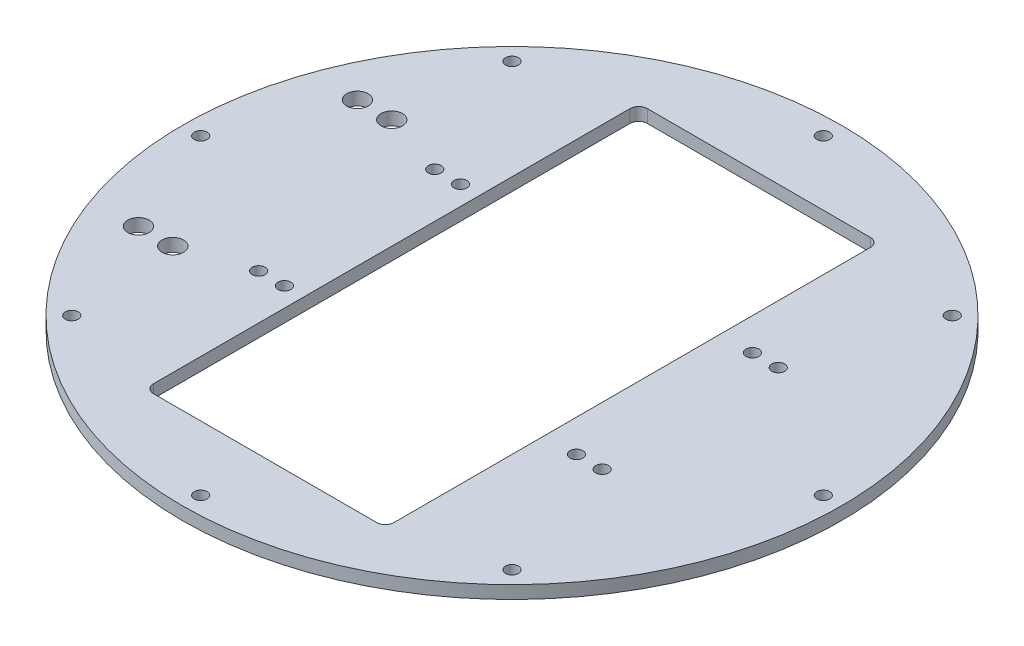
ISO-10303-21;
HEADER;
FILE_DESCRIPTION(('STEP AP214'),'2;1');
FILE_NAME('part.step','',(''),(''),'','','');
FILE_SCHEMA(('AUTOMOTIVE_DESIGN { 1 0 10303 214 1 1 1 1 }'));
ENDSEC;
DATA;
#1=APPLICATION_CONTEXT('core data for automotive mechanical design processes');
#2=APPLICATION_PROTOCOL_DEFINITION('international standard','automotive_design',2000,#1);
#3=PRODUCT_CONTEXT('',#1,'mechanical');
#4=PRODUCT('Part','Part','',(#3));
#5=PRODUCT_RELATED_PRODUCT_CATEGORY('part','',(#4));
#6=PRODUCT_DEFINITION_FORMATION('','',#4);
#7=PRODUCT_DEFINITION_CONTEXT('part definition',#1,'design');
#8=PRODUCT_DEFINITION('design','',#6,#7);
#9=PRODUCT_DEFINITION_SHAPE('','',#8);
#10=(LENGTH_UNIT() NAMED_UNIT(*) SI_UNIT(.MILLI.,.METRE.));
#11=(NAMED_UNIT(*) PLANE_ANGLE_UNIT() SI_UNIT($,.RADIAN.));
#12=(NAMED_UNIT(*) SI_UNIT($,.STERADIAN.) SOLID_ANGLE_UNIT());
#13=UNCERTAINTY_MEASURE_WITH_UNIT(LENGTH_MEASURE(1.E-05),#10,'distance_accuracy_value','');
#14=(GEOMETRIC_REPRESENTATION_CONTEXT(3) GLOBAL_UNCERTAINTY_ASSIGNED_CONTEXT((#13)) GLOBAL_UNIT_ASSIGNED_CONTEXT((#10,
#11,#12)) REPRESENTATION_CONTEXT('',''));
#15=CARTESIAN_POINT('',(0.,0.,0.));
#16=DIRECTION('',(0.,0.,1.));
#17=DIRECTION('',(1.,0.,0.));
#18=AXIS2_PLACEMENT_3D('',#15,#16,#17);
#19=CARTESIAN_POINT('',(0.,3.,0.));
#20=DIRECTION('',(0.,1.,0.));
#21=DIRECTION('',(0.,0.,1.));
#22=AXIS2_PLACEMENT_3D('',#19,#20,#21);
#23=PLANE('',#22);
#24=CARTESIAN_POINT('',(-53.5,3.,25.5));
#25=DIRECTION('',(0.,1.,0.));
#26=DIRECTION('',(0.,0.,-1.));
#27=AXIS2_PLACEMENT_3D('',#24,#25,#26);
#28=CIRCLE('',#27,2.5);
#29=CARTESIAN_POINT('',(-53.5,3.,23.));
#30=VERTEX_POINT('',#29);
#31=EDGE_CURVE('E288',#30,#30,#28,.T.);
#32=ORIENTED_EDGE('',*,*,#31,.F.);
#33=EDGE_LOOP('',(#32));
#34=FACE_BOUND('',#33,.T.);
#35=CARTESIAN_POINT('',(-53.5,3.,-25.5));
#36=DIRECTION('',(0.,1.,0.));
#37=DIRECTION('',(0.,0.,1.));
#38=AXIS2_PLACEMENT_3D('',#35,#36,#37);
#39=CIRCLE('',#38,2.5);
#40=CARTESIAN_POINT('',(-53.5,3.,-23.));
#41=VERTEX_POINT('',#40);
#42=EDGE_CURVE('E276',#41,#41,#39,.T.);
#43=ORIENTED_EDGE('',*,*,#42,.F.);
#44=EDGE_LOOP('',(#43));
#45=FACE_BOUND('',#44,.T.);
#46=CARTESIAN_POINT('',(35.5,3.,20.4999999999999));
#47=DIRECTION('',(0.,1.,0.));
#48=DIRECTION('',(0.,0.,1.));
#49=AXIS2_PLACEMENT_3D('',#46,#47,#48);
#50=CIRCLE('',#49,1.5);
#51=CARTESIAN_POINT('',(35.5,3.,21.9999999999999));
#52=VERTEX_POINT('',#51);
#53=EDGE_CURVE('E264',#52,#52,#50,.T.);
#54=ORIENTED_EDGE('',*,*,#53,.F.);
#55=EDGE_LOOP('',(#54));
#56=FACE_BOUND('',#55,.T.);
#57=CARTESIAN_POINT('',(35.5,3.,-20.5000000000001));
#58=DIRECTION('',(0.,1.,0.));
#59=DIRECTION('',(0.,0.,1.));
#60=AXIS2_PLACEMENT_3D('',#57,#58,#59);
#61=CIRCLE('',#60,1.5);
#62=CARTESIAN_POINT('',(35.5,3.,-19.0000000000001));
#63=VERTEX_POINT('',#62);
#64=EDGE_CURVE('E252',#63,#63,#61,.T.);
#65=ORIENTED_EDGE('',*,*,#64,.F.);
#66=EDGE_LOOP('',(#65));
#67=FACE_BOUND('',#66,.T.);
#68=CARTESIAN_POINT('',(-38.5,3.,-20.5000000000001));
#69=DIRECTION('',(0.,1.,0.));
#70=DIRECTION('',(0.,0.,1.));
#71=AXIS2_PLACEMENT_3D('',#68,#69,#70);
#72=CIRCLE('',#71,1.5);
#73=CARTESIAN_POINT('',(-38.5,3.,-19.0000000000001));
#74=VERTEX_POINT('',#73);
#75=EDGE_CURVE('E240',#74,#74,#72,.T.);
#76=ORIENTED_EDGE('',*,*,#75,.F.);
#77=EDGE_LOOP('',(#76));
#78=FACE_BOUND('',#77,.T.);
#79=CARTESIAN_POINT('',(-32.5,3.,20.4999999999999));
#80=DIRECTION('',(0.,1.,0.));
#81=DIRECTION('',(0.,0.,1.));
#82=AXIS2_PLACEMENT_3D('',#79,#80,#81);
#83=CIRCLE('',#82,1.5);
#84=CARTESIAN_POINT('',(-32.5,3.,21.9999999999999));
#85=VERTEX_POINT('',#84);
#86=EDGE_CURVE('E228',#85,#85,#83,.T.);
#87=ORIENTED_EDGE('',*,*,#86,.F.);
#88=EDGE_LOOP('',(#87));
#89=FACE_BOUND('',#88,.T.);
#90=CARTESIAN_POINT('',(-72.5,3.,0.));
#91=DIRECTION('',(0.,1.,0.));
#92=DIRECTION('',(0.,0.,1.));
#93=AXIS2_PLACEMENT_3D('',#90,#91,#92);
#94=CIRCLE('',#93,1.5);
#95=CARTESIAN_POINT('',(-72.5,3.,1.50000000000001));
#96=VERTEX_POINT('',#95);
#97=EDGE_CURVE('E216',#96,#96,#94,.T.);
#98=ORIENTED_EDGE('',*,*,#97,.F.);
#99=EDGE_LOOP('',(#98));
#100=FACE_BOUND('',#99,.T.);
#101=CARTESIAN_POINT('',(0.,3.,72.5));
#102=DIRECTION('',(0.,1.,0.));
#103=DIRECTION('',(0.,0.,1.));
#104=AXIS2_PLACEMENT_3D('',#101,#102,#103);
#105=CIRCLE('',#104,1.5);
#106=CARTESIAN_POINT('',(0.,3.,74.));
#107=VERTEX_POINT('',#106);
#108=EDGE_CURVE('E204',#107,#107,#105,.T.);
#109=ORIENTED_EDGE('',*,*,#108,.F.);
#110=EDGE_LOOP('',(#109));
#111=FACE_BOUND('',#110,.T.);
#112=CARTESIAN_POINT('',(72.5,3.,0.));
#113=DIRECTION('',(0.,1.,0.));
#114=DIRECTION('',(0.,0.,1.));
#115=AXIS2_PLACEMENT_3D('',#112,#113,#114);
#116=CIRCLE('',#115,1.5);
#117=CARTESIAN_POINT('',(72.5,3.,1.49999999999999));
#118=VERTEX_POINT('',#117);
#119=EDGE_CURVE('E192',#118,#118,#116,.T.);
#120=ORIENTED_EDGE('',*,*,#119,.F.);
#121=EDGE_LOOP('',(#120));
#122=FACE_BOUND('',#121,.T.);
#123=DIRECTION('',(-1.,0.,0.));
#124=VECTOR('',#123,1.);
#125=CARTESIAN_POINT('',(-27.9999999999894,3.,-57.5));
#126=LINE('',#125,#124);
#127=CARTESIAN_POINT('',(25.9999999999894,3.,-57.5));
#128=VERTEX_POINT('',#127);
#129=CARTESIAN_POINT('',(-25.9999999999894,3.,-57.5));
#130=VERTEX_POINT('',#129);
#131=EDGE_CURVE('E155',#128,#130,#126,.T.);
#132=ORIENTED_EDGE('',*,*,#131,.F.);
#133=CARTESIAN_POINT('',(25.9999999999894,3.,-55.5));
#134=DIRECTION('',(0.,1.,0.));
#135=DIRECTION('',(0.,0.,1.));
#136=AXIS2_PLACEMENT_3D('',#133,#134,#135);
#137=CIRCLE('',#136,2.);
#138=CARTESIAN_POINT('',(27.9999999999894,3.,-55.5));
#139=VERTEX_POINT('',#138);
#140=EDGE_CURVE('E108',#128,#139,#137,.F.);
#141=ORIENTED_EDGE('',*,*,#140,.T.);
#142=DIRECTION('',(0.,0.,-1.));
#143=VECTOR('',#142,1.);
#144=CARTESIAN_POINT('',(27.9999999999894,3.,-57.5));
#145=LINE('',#144,#143);
#146=CARTESIAN_POINT('',(27.9999999999894,3.,55.5));
#147=VERTEX_POINT('',#146);
#148=EDGE_CURVE('E153',#147,#139,#145,.T.);
#149=ORIENTED_EDGE('',*,*,#148,.F.);
#150=CARTESIAN_POINT('',(25.9999999999894,3.,55.5));
#151=DIRECTION('',(0.,1.,0.));
#152=DIRECTION('',(0.,0.,1.));
#153=AXIS2_PLACEMENT_3D('',#150,#151,#152);
#154=CIRCLE('',#153,2.);
#155=CARTESIAN_POINT('',(25.9999999999894,3.,57.5));
#156=VERTEX_POINT('',#155);
#157=EDGE_CURVE('E145',#147,#156,#154,.F.);
#158=ORIENTED_EDGE('',*,*,#157,.T.);
#159=DIRECTION('',(1.,0.,0.));
#160=VECTOR('',#159,1.);
#161=CARTESIAN_POINT('',(-27.9999999999894,3.,57.5));
#162=LINE('',#161,#160);
#163=CARTESIAN_POINT('',(-25.9999999999894,3.,57.5));
#164=VERTEX_POINT('',#163);
#165=EDGE_CURVE('E178',#164,#156,#162,.T.);
#166=ORIENTED_EDGE('',*,*,#165,.F.);
#167=CARTESIAN_POINT('',(-25.9999999999894,3.,55.5));
#168=DIRECTION('',(0.,1.,0.));
#169=DIRECTION('',(0.,0.,1.));
#170=AXIS2_PLACEMENT_3D('',#167,#168,#169);
#171=CIRCLE('',#170,2.);
#172=CARTESIAN_POINT('',(-27.9999999999894,3.,55.5));
#173=VERTEX_POINT('',#172);
#174=EDGE_CURVE('E141',#164,#173,#171,.F.);
#175=ORIENTED_EDGE('',*,*,#174,.T.);
#176=DIRECTION('',(0.,0.,1.));
#177=VECTOR('',#176,1.);
#178=CARTESIAN_POINT('',(-27.9999999999894,3.,-57.5));
#179=LINE('',#178,#177);
#180=CARTESIAN_POINT('',(-27.9999999999894,3.,-55.5));
#181=VERTEX_POINT('',#180);
#182=EDGE_CURVE('E182',#181,#173,#179,.T.);
#183=ORIENTED_EDGE('',*,*,#182,.F.);
#184=CARTESIAN_POINT('',(-25.9999999999894,3.,-55.5));
#185=DIRECTION('',(0.,1.,0.));
#186=DIRECTION('',(0.,0.,1.));
#187=AXIS2_PLACEMENT_3D('',#184,#185,#186);
#188=CIRCLE('',#187,2.);
#189=EDGE_CURVE('E11',#181,#130,#188,.F.);
#190=ORIENTED_EDGE('',*,*,#189,.T.);
#191=EDGE_LOOP('',(#132,#141,#149,#158,#166,#175,#183,#190));
#192=FACE_BOUND('',#191,.T.);
#193=CARTESIAN_POINT('',(0.,3.,-72.5));
#194=DIRECTION('',(0.,1.,0.));
#195=DIRECTION('',(0.,0.,1.));
#196=AXIS2_PLACEMENT_3D('',#193,#194,#195);
#197=CIRCLE('',#196,1.5);
#198=CARTESIAN_POINT('',(0.,3.,-71.));
#199=VERTEX_POINT('',#198);
#200=EDGE_CURVE('E173',#199,#199,#197,.T.);
#201=ORIENTED_EDGE('',*,*,#200,.F.);
#202=EDGE_LOOP('',(#201));
#203=FACE_BOUND('',#202,.T.);
#204=CARTESIAN_POINT('',(0.,3.,0.));
#205=DIRECTION('',(0.,1.,0.));
#206=DIRECTION('',(0.,0.,1.));
#207=AXIS2_PLACEMENT_3D('',#204,#205,#206);
#208=CIRCLE('',#207,76.75);
#209=CARTESIAN_POINT('',(0.,3.,76.75));
#210=VERTEX_POINT('',#209);
#211=EDGE_CURVE('E118',#210,#210,#208,.T.);
#212=ORIENTED_EDGE('',*,*,#211,.T.);
#213=EDGE_LOOP('',(#212));
#214=FACE_BOUND('',#213,.T.);
#215=CARTESIAN_POINT('',(51.2652416360247,3.,-51.2652416360247));
#216=DIRECTION('',(0.,1.,0.));
#217=DIRECTION('',(0.,0.,1.));
#218=AXIS2_PLACEMENT_3D('',#215,#216,#217);
#219=CIRCLE('',#218,1.50000000000001);
#220=CARTESIAN_POINT('',(51.2652416360247,3.,-49.7652416360247));
#221=VERTEX_POINT('',#220);
#222=EDGE_CURVE('E168',#221,#221,#219,.T.);
#223=ORIENTED_EDGE('',*,*,#222,.F.);
#224=EDGE_LOOP('',(#223));
#225=FACE_BOUND('',#224,.T.);
#226=CARTESIAN_POINT('',(51.2652416360247,3.,51.2652416360247));
#227=DIRECTION('',(0.,1.,0.));
#228=DIRECTION('',(0.,0.,1.));
#229=AXIS2_PLACEMENT_3D('',#226,#227,#228);
#230=CIRCLE('',#229,1.50000000000001);
#231=CARTESIAN_POINT('',(51.2652416360247,3.,52.7652416360247));
#232=VERTEX_POINT('',#231);
#233=EDGE_CURVE('E198',#232,#232,#230,.T.);
#234=ORIENTED_EDGE('',*,*,#233,.F.);
#235=EDGE_LOOP('',(#234));
#236=FACE_BOUND('',#235,.T.);
#237=CARTESIAN_POINT('',(-51.2652416360247,3.,51.2652416360247));
#238=DIRECTION('',(0.,1.,0.));
#239=DIRECTION('',(0.,0.,1.));
#240=AXIS2_PLACEMENT_3D('',#237,#238,#239);
#241=CIRCLE('',#240,1.5);
#242=CARTESIAN_POINT('',(-51.2652416360247,3.,52.7652416360247));
#243=VERTEX_POINT('',#242);
#244=EDGE_CURVE('E210',#243,#243,#241,.T.);
#245=ORIENTED_EDGE('',*,*,#244,.F.);
#246=EDGE_LOOP('',(#245));
#247=FACE_BOUND('',#246,.T.);
#248=CARTESIAN_POINT('',(-51.2652416360247,3.,-51.2652416360247));
#249=DIRECTION('',(0.,1.,0.));
#250=DIRECTION('',(0.,0.,1.));
#251=AXIS2_PLACEMENT_3D('',#248,#249,#250);
#252=CIRCLE('',#251,1.50000000000001);
#253=CARTESIAN_POINT('',(-51.2652416360247,3.,-49.7652416360247));
#254=VERTEX_POINT('',#253);
#255=EDGE_CURVE('E222',#254,#254,#252,.T.);
#256=ORIENTED_EDGE('',*,*,#255,.F.);
#257=EDGE_LOOP('',(#256));
#258=FACE_BOUND('',#257,.T.);
#259=CARTESIAN_POINT('',(-38.5,3.,20.4999999999999));
#260=DIRECTION('',(0.,1.,0.));
#261=DIRECTION('',(0.,0.,1.));
#262=AXIS2_PLACEMENT_3D('',#259,#260,#261);
#263=CIRCLE('',#262,1.5);
#264=CARTESIAN_POINT('',(-38.5,3.,21.9999999999999));
#265=VERTEX_POINT('',#264);
#266=EDGE_CURVE('E234',#265,#265,#263,.T.);
#267=ORIENTED_EDGE('',*,*,#266,.F.);
#268=EDGE_LOOP('',(#267));
#269=FACE_BOUND('',#268,.T.);
#270=CARTESIAN_POINT('',(-32.5,3.,-20.5000000000001));
#271=DIRECTION('',(0.,1.,0.));
#272=DIRECTION('',(0.,0.,1.));
#273=AXIS2_PLACEMENT_3D('',#270,#271,#272);
#274=CIRCLE('',#273,1.5);
#275=CARTESIAN_POINT('',(-32.5,3.,-19.0000000000001));
#276=VERTEX_POINT('',#275);
#277=EDGE_CURVE('E246',#276,#276,#274,.T.);
#278=ORIENTED_EDGE('',*,*,#277,.F.);
#279=EDGE_LOOP('',(#278));
#280=FACE_BOUND('',#279,.T.);
#281=CARTESIAN_POINT('',(41.5,3.,-20.5000000000001));
#282=DIRECTION('',(0.,1.,0.));
#283=DIRECTION('',(0.,0.,1.));
#284=AXIS2_PLACEMENT_3D('',#281,#282,#283);
#285=CIRCLE('',#284,1.5);
#286=CARTESIAN_POINT('',(41.5,3.,-19.0000000000001));
#287=VERTEX_POINT('',#286);
#288=EDGE_CURVE('E258',#287,#287,#285,.T.);
#289=ORIENTED_EDGE('',*,*,#288,.F.);
#290=EDGE_LOOP('',(#289));
#291=FACE_BOUND('',#290,.T.);
#292=CARTESIAN_POINT('',(41.5,3.,20.4999999999999));
#293=DIRECTION('',(0.,1.,0.));
#294=DIRECTION('',(0.,0.,1.));
#295=AXIS2_PLACEMENT_3D('',#292,#293,#294);
#296=CIRCLE('',#295,1.5);
#297=CARTESIAN_POINT('',(41.5,3.,21.9999999999999));
#298=VERTEX_POINT('',#297);
#299=EDGE_CURVE('E270',#298,#298,#296,.T.);
#300=ORIENTED_EDGE('',*,*,#299,.F.);
#301=EDGE_LOOP('',(#300));
#302=FACE_BOUND('',#301,.T.);
#303=CARTESIAN_POINT('',(-61.5,3.,-25.5));
#304=DIRECTION('',(0.,1.,0.));
#305=DIRECTION('',(0.,0.,1.));
#306=AXIS2_PLACEMENT_3D('',#303,#304,#305);
#307=CIRCLE('',#306,2.5);
#308=CARTESIAN_POINT('',(-61.5,3.,-23.));
#309=VERTEX_POINT('',#308);
#310=EDGE_CURVE('E282',#309,#309,#307,.T.);
#311=ORIENTED_EDGE('',*,*,#310,.F.);
#312=EDGE_LOOP('',(#311));
#313=FACE_BOUND('',#312,.T.);
#314=CARTESIAN_POINT('',(-61.5,3.,25.5));
#315=DIRECTION('',(0.,1.,0.));
#316=DIRECTION('',(0.,0.,-1.));
#317=AXIS2_PLACEMENT_3D('',#314,#315,#316);
#318=CIRCLE('',#317,2.5);
#319=CARTESIAN_POINT('',(-61.5,3.,23.));
#320=VERTEX_POINT('',#319);
#321=EDGE_CURVE('E294',#320,#320,#318,.T.);
#322=ORIENTED_EDGE('',*,*,#321,.F.);
#323=EDGE_LOOP('',(#322));
#324=FACE_BOUND('',#323,.T.);
#325=ADVANCED_FACE('F33',(#34,#45,#56,#67,#78,#89,#100,#111,#122,#192,#203,#214,#225,#236,#247,
#258,#269,#280,#291,#302,#313,#324),#23,.T.);
#326=CARTESIAN_POINT('',(0.,0.,0.));
#327=DIRECTION('',(0.,1.,0.));
#328=DIRECTION('',(0.,0.,1.));
#329=AXIS2_PLACEMENT_3D('',#326,#327,#328);
#330=PLANE('',#329);
#331=CARTESIAN_POINT('',(0.,0.,-72.5));
#332=DIRECTION('',(0.,1.,0.));
#333=DIRECTION('',(0.,0.,1.));
#334=AXIS2_PLACEMENT_3D('',#331,#332,#333);
#335=CIRCLE('',#334,1.5);
#336=CARTESIAN_POINT('',(0.,0.,-71.));
#337=VERTEX_POINT('',#336);
#338=EDGE_CURVE('E176',#337,#337,#335,.T.);
#339=ORIENTED_EDGE('',*,*,#338,.T.);
#340=EDGE_LOOP('',(#339));
#341=FACE_BOUND('',#340,.T.);
#342=CARTESIAN_POINT('',(0.,0.,0.));
#343=DIRECTION('',(0.,1.,0.));
#344=DIRECTION('',(0.,0.,1.));
#345=AXIS2_PLACEMENT_3D('',#342,#343,#344);
#346=CIRCLE('',#345,76.75);
#347=CARTESIAN_POINT('',(0.,0.,76.75));
#348=VERTEX_POINT('',#347);
#349=EDGE_CURVE('E123',#348,#348,#346,.T.);
#350=ORIENTED_EDGE('',*,*,#349,.F.);
#351=EDGE_LOOP('',(#350));
#352=FACE_BOUND('',#351,.T.);
#353=DIRECTION('',(1.,0.,0.));
#354=VECTOR('',#353,1.);
#355=CARTESIAN_POINT('',(-27.9999999999894,0.,57.5));
#356=LINE('',#355,#354);
#357=CARTESIAN_POINT('',(-25.9999999999894,0.,57.5));
#358=VERTEX_POINT('',#357);
#359=CARTESIAN_POINT('',(25.9999999999894,0.,57.5));
#360=VERTEX_POINT('',#359);
#361=EDGE_CURVE('E116',#358,#360,#356,.T.);
#362=ORIENTED_EDGE('',*,*,#361,.T.);
#363=CARTESIAN_POINT('',(25.9999999999894,0.,55.5));
#364=DIRECTION('',(0.,1.,0.));
#365=DIRECTION('',(0.,0.,1.));
#366=AXIS2_PLACEMENT_3D('',#363,#364,#365);
#367=CIRCLE('',#366,2.);
#368=CARTESIAN_POINT('',(27.9999999999894,0.,55.5));
#369=VERTEX_POINT('',#368);
#370=EDGE_CURVE('E143',#360,#369,#367,.T.);
#371=ORIENTED_EDGE('',*,*,#370,.T.);
#372=DIRECTION('',(0.,0.,-1.));
#373=VECTOR('',#372,1.);
#374=CARTESIAN_POINT('',(27.9999999999894,0.,-57.5));
#375=LINE('',#374,#373);
#376=CARTESIAN_POINT('',(27.9999999999894,0.,-55.5));
#377=VERTEX_POINT('',#376);
#378=EDGE_CURVE('E165',#369,#377,#375,.T.);
#379=ORIENTED_EDGE('',*,*,#378,.T.);
#380=CARTESIAN_POINT('',(25.9999999999894,0.,-55.5));
#381=DIRECTION('',(0.,1.,0.));
#382=DIRECTION('',(0.,0.,1.));
#383=AXIS2_PLACEMENT_3D('',#380,#381,#382);
#384=CIRCLE('',#383,2.);
#385=CARTESIAN_POINT('',(25.9999999999894,0.,-57.5));
#386=VERTEX_POINT('',#385);
#387=EDGE_CURVE('E147',#377,#386,#384,.T.);
#388=ORIENTED_EDGE('',*,*,#387,.T.);
#389=DIRECTION('',(-1.,0.,0.));
#390=VECTOR('',#389,1.);
#391=CARTESIAN_POINT('',(-27.9999999999894,0.,-57.5));
#392=LINE('',#391,#390);
#393=CARTESIAN_POINT('',(-25.9999999999894,0.,-57.5));
#394=VERTEX_POINT('',#393);
#395=EDGE_CURVE('E103',#386,#394,#392,.T.);
#396=ORIENTED_EDGE('',*,*,#395,.T.);
#397=CARTESIAN_POINT('',(-25.9999999999894,0.,-55.5));
#398=DIRECTION('',(0.,1.,0.));
#399=DIRECTION('',(0.,0.,1.));
#400=AXIS2_PLACEMENT_3D('',#397,#398,#399);
#401=CIRCLE('',#400,2.);
#402=CARTESIAN_POINT('',(-27.9999999999894,0.,-55.5));
#403=VERTEX_POINT('',#402);
#404=EDGE_CURVE('E41',#394,#403,#401,.T.);
#405=ORIENTED_EDGE('',*,*,#404,.T.);
#406=DIRECTION('',(0.,0.,1.));
#407=VECTOR('',#406,1.);
#408=CARTESIAN_POINT('',(-27.9999999999894,0.,-57.5));
#409=LINE('',#408,#407);
#410=CARTESIAN_POINT('',(-27.9999999999894,0.,55.5));
#411=VERTEX_POINT('',#410);
#412=EDGE_CURVE('E102',#403,#411,#409,.T.);
#413=ORIENTED_EDGE('',*,*,#412,.T.);
#414=CARTESIAN_POINT('',(-25.9999999999894,0.,55.5));
#415=DIRECTION('',(0.,1.,0.));
#416=DIRECTION('',(0.,0.,1.));
#417=AXIS2_PLACEMENT_3D('',#414,#415,#416);
#418=CIRCLE('',#417,2.);
#419=EDGE_CURVE('E139',#411,#358,#418,.T.);
#420=ORIENTED_EDGE('',*,*,#419,.T.);
#421=EDGE_LOOP('',(#362,#371,#379,#388,#396,#405,#413,#420));
#422=FACE_BOUND('',#421,.T.);
#423=CARTESIAN_POINT('',(51.2652416360247,0.,-51.2652416360247));
#424=DIRECTION('',(0.,1.,0.));
#425=DIRECTION('',(0.,0.,1.));
#426=AXIS2_PLACEMENT_3D('',#423,#424,#425);
#427=CIRCLE('',#426,1.50000000000001);
#428=CARTESIAN_POINT('',(51.2652416360247,0.,-49.7652416360247));
#429=VERTEX_POINT('',#428);
#430=EDGE_CURVE('E189',#429,#429,#427,.T.);
#431=ORIENTED_EDGE('',*,*,#430,.T.);
#432=EDGE_LOOP('',(#431));
#433=FACE_BOUND('',#432,.T.);
#434=CARTESIAN_POINT('',(72.5,0.,0.));
#435=DIRECTION('',(0.,1.,0.));
#436=DIRECTION('',(0.,0.,1.));
#437=AXIS2_PLACEMENT_3D('',#434,#435,#436);
#438=CIRCLE('',#437,1.5);
#439=CARTESIAN_POINT('',(72.5,0.,1.49999999999999));
#440=VERTEX_POINT('',#439);
#441=EDGE_CURVE('E195',#440,#440,#438,.T.);
#442=ORIENTED_EDGE('',*,*,#441,.T.);
#443=EDGE_LOOP('',(#442));
#444=FACE_BOUND('',#443,.T.);
#445=CARTESIAN_POINT('',(51.2652416360247,0.,51.2652416360247));
#446=DIRECTION('',(0.,1.,0.));
#447=DIRECTION('',(0.,0.,1.));
#448=AXIS2_PLACEMENT_3D('',#445,#446,#447);
#449=CIRCLE('',#448,1.50000000000001);
#450=CARTESIAN_POINT('',(51.2652416360247,0.,52.7652416360247));
#451=VERTEX_POINT('',#450);
#452=EDGE_CURVE('E201',#451,#451,#449,.T.);
#453=ORIENTED_EDGE('',*,*,#452,.T.);
#454=EDGE_LOOP('',(#453));
#455=FACE_BOUND('',#454,.T.);
#456=CARTESIAN_POINT('',(0.,0.,72.5));
#457=DIRECTION('',(0.,1.,0.));
#458=DIRECTION('',(0.,0.,1.));
#459=AXIS2_PLACEMENT_3D('',#456,#457,#458);
#460=CIRCLE('',#459,1.5);
#461=CARTESIAN_POINT('',(0.,0.,74.));
#462=VERTEX_POINT('',#461);
#463=EDGE_CURVE('E207',#462,#462,#460,.T.);
#464=ORIENTED_EDGE('',*,*,#463,.T.);
#465=EDGE_LOOP('',(#464));
#466=FACE_BOUND('',#465,.T.);
#467=CARTESIAN_POINT('',(-51.2652416360247,0.,51.2652416360247));
#468=DIRECTION('',(0.,1.,0.));
#469=DIRECTION('',(0.,0.,1.));
#470=AXIS2_PLACEMENT_3D('',#467,#468,#469);
#471=CIRCLE('',#470,1.5);
#472=CARTESIAN_POINT('',(-51.2652416360247,0.,52.7652416360247));
#473=VERTEX_POINT('',#472);
#474=EDGE_CURVE('E213',#473,#473,#471,.T.);
#475=ORIENTED_EDGE('',*,*,#474,.T.);
#476=EDGE_LOOP('',(#475));
#477=FACE_BOUND('',#476,.T.);
#478=CARTESIAN_POINT('',(-72.5,0.,0.));
#479=DIRECTION('',(0.,1.,0.));
#480=DIRECTION('',(0.,0.,1.));
#481=AXIS2_PLACEMENT_3D('',#478,#479,#480);
#482=CIRCLE('',#481,1.5);
#483=CARTESIAN_POINT('',(-72.5,0.,1.50000000000001));
#484=VERTEX_POINT('',#483);
#485=EDGE_CURVE('E219',#484,#484,#482,.T.);
#486=ORIENTED_EDGE('',*,*,#485,.T.);
#487=EDGE_LOOP('',(#486));
#488=FACE_BOUND('',#487,.T.);
#489=CARTESIAN_POINT('',(-51.2652416360247,0.,-51.2652416360247));
#490=DIRECTION('',(0.,1.,0.));
#491=DIRECTION('',(0.,0.,1.));
#492=AXIS2_PLACEMENT_3D('',#489,#490,#491);
#493=CIRCLE('',#492,1.50000000000001);
#494=CARTESIAN_POINT('',(-51.2652416360247,0.,-49.7652416360247));
#495=VERTEX_POINT('',#494);
#496=EDGE_CURVE('E225',#495,#495,#493,.T.);
#497=ORIENTED_EDGE('',*,*,#496,.T.);
#498=EDGE_LOOP('',(#497));
#499=FACE_BOUND('',#498,.T.);
#500=CARTESIAN_POINT('',(-32.5,0.,20.4999999999999));
#501=DIRECTION('',(0.,1.,0.));
#502=DIRECTION('',(0.,0.,1.));
#503=AXIS2_PLACEMENT_3D('',#500,#501,#502);
#504=CIRCLE('',#503,1.5);
#505=CARTESIAN_POINT('',(-32.5,0.,21.9999999999999));
#506=VERTEX_POINT('',#505);
#507=EDGE_CURVE('E231',#506,#506,#504,.T.);
#508=ORIENTED_EDGE('',*,*,#507,.T.);
#509=EDGE_LOOP('',(#508));
#510=FACE_BOUND('',#509,.T.);
#511=CARTESIAN_POINT('',(-38.5,0.,20.4999999999999));
#512=DIRECTION('',(0.,1.,0.));
#513=DIRECTION('',(0.,0.,1.));
#514=AXIS2_PLACEMENT_3D('',#511,#512,#513);
#515=CIRCLE('',#514,1.5);
#516=CARTESIAN_POINT('',(-38.5,0.,21.9999999999999));
#517=VERTEX_POINT('',#516);
#518=EDGE_CURVE('E237',#517,#517,#515,.T.);
#519=ORIENTED_EDGE('',*,*,#518,.T.);
#520=EDGE_LOOP('',(#519));
#521=FACE_BOUND('',#520,.T.);
#522=CARTESIAN_POINT('',(-38.5,0.,-20.5000000000001));
#523=DIRECTION('',(0.,1.,0.));
#524=DIRECTION('',(0.,0.,1.));
#525=AXIS2_PLACEMENT_3D('',#522,#523,#524);
#526=CIRCLE('',#525,1.5);
#527=CARTESIAN_POINT('',(-38.5,0.,-19.0000000000001));
#528=VERTEX_POINT('',#527);
#529=EDGE_CURVE('E243',#528,#528,#526,.T.);
#530=ORIENTED_EDGE('',*,*,#529,.T.);
#531=EDGE_LOOP('',(#530));
#532=FACE_BOUND('',#531,.T.);
#533=CARTESIAN_POINT('',(-32.5,0.,-20.5000000000001));
#534=DIRECTION('',(0.,1.,0.));
#535=DIRECTION('',(0.,0.,1.));
#536=AXIS2_PLACEMENT_3D('',#533,#534,#535);
#537=CIRCLE('',#536,1.5);
#538=CARTESIAN_POINT('',(-32.5,0.,-19.0000000000001));
#539=VERTEX_POINT('',#538);
#540=EDGE_CURVE('E249',#539,#539,#537,.T.);
#541=ORIENTED_EDGE('',*,*,#540,.T.);
#542=EDGE_LOOP('',(#541));
#543=FACE_BOUND('',#542,.T.);
#544=CARTESIAN_POINT('',(35.5,0.,-20.5000000000001));
#545=DIRECTION('',(0.,1.,0.));
#546=DIRECTION('',(0.,0.,1.));
#547=AXIS2_PLACEMENT_3D('',#544,#545,#546);
#548=CIRCLE('',#547,1.5);
#549=CARTESIAN_POINT('',(35.5,0.,-19.0000000000001));
#550=VERTEX_POINT('',#549);
#551=EDGE_CURVE('E255',#550,#550,#548,.T.);
#552=ORIENTED_EDGE('',*,*,#551,.T.);
#553=EDGE_LOOP('',(#552));
#554=FACE_BOUND('',#553,.T.);
#555=CARTESIAN_POINT('',(41.5,0.,-20.5000000000001));
#556=DIRECTION('',(0.,1.,0.));
#557=DIRECTION('',(0.,0.,1.));
#558=AXIS2_PLACEMENT_3D('',#555,#556,#557);
#559=CIRCLE('',#558,1.5);
#560=CARTESIAN_POINT('',(41.5,0.,-19.0000000000001));
#561=VERTEX_POINT('',#560);
#562=EDGE_CURVE('E261',#561,#561,#559,.T.);
#563=ORIENTED_EDGE('',*,*,#562,.T.);
#564=EDGE_LOOP('',(#563));
#565=FACE_BOUND('',#564,.T.);
#566=CARTESIAN_POINT('',(35.5,0.,20.4999999999999));
#567=DIRECTION('',(0.,1.,0.));
#568=DIRECTION('',(0.,0.,1.));
#569=AXIS2_PLACEMENT_3D('',#566,#567,#568);
#570=CIRCLE('',#569,1.5);
#571=CARTESIAN_POINT('',(35.5,0.,21.9999999999999));
#572=VERTEX_POINT('',#571);
#573=EDGE_CURVE('E267',#572,#572,#570,.T.);
#574=ORIENTED_EDGE('',*,*,#573,.T.);
#575=EDGE_LOOP('',(#574));
#576=FACE_BOUND('',#575,.T.);
#577=CARTESIAN_POINT('',(41.5,0.,20.4999999999999));
#578=DIRECTION('',(0.,1.,0.));
#579=DIRECTION('',(0.,0.,1.));
#580=AXIS2_PLACEMENT_3D('',#577,#578,#579);
#581=CIRCLE('',#580,1.5);
#582=CARTESIAN_POINT('',(41.5,0.,21.9999999999999));
#583=VERTEX_POINT('',#582);
#584=EDGE_CURVE('E273',#583,#583,#581,.T.);
#585=ORIENTED_EDGE('',*,*,#584,.T.);
#586=EDGE_LOOP('',(#585));
#587=FACE_BOUND('',#586,.T.);
#588=CARTESIAN_POINT('',(-53.5,0.,-25.5));
#589=DIRECTION('',(0.,1.,0.));
#590=DIRECTION('',(0.,0.,1.));
#591=AXIS2_PLACEMENT_3D('',#588,#589,#590);
#592=CIRCLE('',#591,2.5);
#593=CARTESIAN_POINT('',(-53.5,0.,-23.));
#594=VERTEX_POINT('',#593);
#595=EDGE_CURVE('E279',#594,#594,#592,.T.);
#596=ORIENTED_EDGE('',*,*,#595,.T.);
#597=EDGE_LOOP('',(#596));
#598=FACE_BOUND('',#597,.T.);
#599=CARTESIAN_POINT('',(-61.5,0.,-25.5));
#600=DIRECTION('',(0.,1.,0.));
#601=DIRECTION('',(0.,0.,1.));
#602=AXIS2_PLACEMENT_3D('',#599,#600,#601);
#603=CIRCLE('',#602,2.5);
#604=CARTESIAN_POINT('',(-61.5,0.,-23.));
#605=VERTEX_POINT('',#604);
#606=EDGE_CURVE('E285',#605,#605,#603,.T.);
#607=ORIENTED_EDGE('',*,*,#606,.T.);
#608=EDGE_LOOP('',(#607));
#609=FACE_BOUND('',#608,.T.);
#610=CARTESIAN_POINT('',(-53.5,0.,25.5));
#611=DIRECTION('',(0.,1.,0.));
#612=DIRECTION('',(0.,0.,-1.));
#613=AXIS2_PLACEMENT_3D('',#610,#611,#612);
#614=CIRCLE('',#613,2.5);
#615=CARTESIAN_POINT('',(-53.5,0.,23.));
#616=VERTEX_POINT('',#615);
#617=EDGE_CURVE('E291',#616,#616,#614,.T.);
#618=ORIENTED_EDGE('',*,*,#617,.T.);
#619=EDGE_LOOP('',(#618));
#620=FACE_BOUND('',#619,.T.);
#621=CARTESIAN_POINT('',(-61.5,0.,25.5));
#622=DIRECTION('',(0.,1.,0.));
#623=DIRECTION('',(0.,0.,-1.));
#624=AXIS2_PLACEMENT_3D('',#621,#622,#623);
#625=CIRCLE('',#624,2.5);
#626=CARTESIAN_POINT('',(-61.5,0.,23.));
#627=VERTEX_POINT('',#626);
#628=EDGE_CURVE('E297',#627,#627,#625,.T.);
#629=ORIENTED_EDGE('',*,*,#628,.T.);
#630=EDGE_LOOP('',(#629));
#631=FACE_BOUND('',#630,.T.);
#632=ADVANCED_FACE('F100',(#341,#352,#422,#433,#444,#455,#466,#477,#488,#499,#510,#521,#532,
#543,#554,#565,#576,#587,#598,#609,#620,#631),#330,.F.);
#633=CARTESIAN_POINT('',(0.,3.,0.));
#634=DIRECTION('',(0.,-1.,0.));
#635=DIRECTION('',(0.,0.,-1.));
#636=AXIS2_PLACEMENT_3D('',#633,#634,#635);
#637=CYLINDRICAL_SURFACE('',#636,76.75);
#638=ORIENTED_EDGE('',*,*,#211,.F.);
#639=EDGE_LOOP('',(#638));
#640=FACE_BOUND('',#639,.T.);
#641=ORIENTED_EDGE('',*,*,#349,.T.);
#642=EDGE_LOOP('',(#641));
#643=FACE_BOUND('',#642,.T.);
#644=ADVANCED_FACE('F312',(#640,#643),#637,.T.);
#645=CARTESIAN_POINT('',(0.,3.,-72.5));
#646=DIRECTION('',(0.,-1.,0.));
#647=DIRECTION('',(0.,0.,-1.));
#648=AXIS2_PLACEMENT_3D('',#645,#646,#647);
#649=CYLINDRICAL_SURFACE('',#648,1.5);
#650=ORIENTED_EDGE('',*,*,#200,.T.);
#651=EDGE_LOOP('',(#650));
#652=FACE_BOUND('',#651,.T.);
#653=ORIENTED_EDGE('',*,*,#338,.F.);
#654=EDGE_LOOP('',(#653));
#655=FACE_BOUND('',#654,.T.);
#656=ADVANCED_FACE('F317',(#652,#655),#649,.F.);
#657=CARTESIAN_POINT('',(27.9999999999894,3.,-57.5));
#658=DIRECTION('',(-1.,0.,0.));
#659=DIRECTION('',(0.,0.,1.));
#660=AXIS2_PLACEMENT_3D('',#657,#658,#659);
#661=PLANE('',#660);
#662=ORIENTED_EDGE('',*,*,#378,.F.);
#663=DIRECTION('',(0.,-1.,0.));
#664=VECTOR('',#663,1.);
#665=CARTESIAN_POINT('',(27.9999999999894,3.,55.5));
#666=LINE('',#665,#664);
#667=EDGE_CURVE('E134',#369,#147,#666,.F.);
#668=ORIENTED_EDGE('',*,*,#667,.T.);
#669=ORIENTED_EDGE('',*,*,#148,.T.);
#670=DIRECTION('',(0.,-1.,0.));
#671=VECTOR('',#670,1.);
#672=CARTESIAN_POINT('',(27.9999999999894,0.,-55.5));
#673=LINE('',#672,#671);
#674=EDGE_CURVE('E131',#139,#377,#673,.T.);
#675=ORIENTED_EDGE('',*,*,#674,.T.);
#676=EDGE_LOOP('',(#662,#668,#669,#675));
#677=FACE_BOUND('',#676,.T.);
#678=ADVANCED_FACE('F160',(#677),#661,.T.);
#679=CARTESIAN_POINT('',(-27.9999999999894,3.,-57.5));
#680=DIRECTION('',(0.,0.,1.));
#681=DIRECTION('',(1.,0.,0.));
#682=AXIS2_PLACEMENT_3D('',#679,#680,#681);
#683=PLANE('',#682);
#684=ORIENTED_EDGE('',*,*,#395,.F.);
#685=DIRECTION('',(0.,-1.,0.));
#686=VECTOR('',#685,1.);
#687=CARTESIAN_POINT('',(25.9999999999894,3.,-57.5));
#688=LINE('',#687,#686);
#689=EDGE_CURVE('E53',#386,#128,#688,.F.);
#690=ORIENTED_EDGE('',*,*,#689,.T.);
#691=ORIENTED_EDGE('',*,*,#131,.T.);
#692=DIRECTION('',(0.,-1.,0.));
#693=VECTOR('',#692,1.);
#694=CARTESIAN_POINT('',(-25.9999999999894,0.,-57.5));
#695=LINE('',#694,#693);
#696=EDGE_CURVE('E136',#130,#394,#695,.T.);
#697=ORIENTED_EDGE('',*,*,#696,.T.);
#698=EDGE_LOOP('',(#684,#690,#691,#697));
#699=FACE_BOUND('',#698,.T.);
#700=ADVANCED_FACE('F166',(#699),#683,.T.);
#701=CARTESIAN_POINT('',(-27.9999999999894,3.,-57.5));
#702=DIRECTION('',(1.,0.,0.));
#703=DIRECTION('',(0.,0.,-1.));
#704=AXIS2_PLACEMENT_3D('',#701,#702,#703);
#705=PLANE('',#704);
#706=ORIENTED_EDGE('',*,*,#182,.T.);
#707=DIRECTION('',(0.,-1.,0.));
#708=VECTOR('',#707,1.);
#709=CARTESIAN_POINT('',(-27.9999999999894,0.,55.5));
#710=LINE('',#709,#708);
#711=EDGE_CURVE('E115',#173,#411,#710,.T.);
#712=ORIENTED_EDGE('',*,*,#711,.T.);
#713=ORIENTED_EDGE('',*,*,#412,.F.);
#714=DIRECTION('',(0.,-1.,0.));
#715=VECTOR('',#714,1.);
#716=CARTESIAN_POINT('',(-27.9999999999894,3.,-55.5));
#717=LINE('',#716,#715);
#718=EDGE_CURVE('E113',#403,#181,#717,.F.);
#719=ORIENTED_EDGE('',*,*,#718,.T.);
#720=EDGE_LOOP('',(#706,#712,#713,#719));
#721=FACE_BOUND('',#720,.T.);
#722=ADVANCED_FACE('F112',(#721),#705,.T.);
#723=CARTESIAN_POINT('',(-27.9999999999894,3.,57.5));
#724=DIRECTION('',(0.,0.,-1.));
#725=DIRECTION('',(-1.,0.,0.));
#726=AXIS2_PLACEMENT_3D('',#723,#724,#725);
#727=PLANE('',#726);
#728=ORIENTED_EDGE('',*,*,#361,.F.);
#729=DIRECTION('',(0.,-1.,0.));
#730=VECTOR('',#729,1.);
#731=CARTESIAN_POINT('',(-25.9999999999894,3.,57.5));
#732=LINE('',#731,#730);
#733=EDGE_CURVE('E129',#358,#164,#732,.F.);
#734=ORIENTED_EDGE('',*,*,#733,.T.);
#735=ORIENTED_EDGE('',*,*,#165,.T.);
#736=DIRECTION('',(0.,-1.,0.));
#737=VECTOR('',#736,1.);
#738=CARTESIAN_POINT('',(25.9999999999894,0.,57.5));
#739=LINE('',#738,#737);
#740=EDGE_CURVE('E120',#156,#360,#739,.T.);
#741=ORIENTED_EDGE('',*,*,#740,.T.);
#742=EDGE_LOOP('',(#728,#734,#735,#741));
#743=FACE_BOUND('',#742,.T.);
#744=ADVANCED_FACE('F359',(#743),#727,.T.);
#745=CARTESIAN_POINT('',(51.2652416360247,3.,-51.2652416360247));
#746=DIRECTION('',(0.,-1.,0.));
#747=DIRECTION('',(0.,0.,-1.));
#748=AXIS2_PLACEMENT_3D('',#745,#746,#747);
#749=CYLINDRICAL_SURFACE('',#748,1.50000000000001);
#750=ORIENTED_EDGE('',*,*,#222,.T.);
#751=EDGE_LOOP('',(#750));
#752=FACE_BOUND('',#751,.T.);
#753=ORIENTED_EDGE('',*,*,#430,.F.);
#754=EDGE_LOOP('',(#753));
#755=FACE_BOUND('',#754,.T.);
#756=ADVANCED_FACE('F364',(#752,#755),#749,.F.);
#757=CARTESIAN_POINT('',(72.5,3.,0.));
#758=DIRECTION('',(0.,-1.,0.));
#759=DIRECTION('',(0.,0.,-1.));
#760=AXIS2_PLACEMENT_3D('',#757,#758,#759);
#761=CYLINDRICAL_SURFACE('',#760,1.5);
#762=ORIENTED_EDGE('',*,*,#119,.T.);
#763=EDGE_LOOP('',(#762));
#764=FACE_BOUND('',#763,.T.);
#765=ORIENTED_EDGE('',*,*,#441,.F.);
#766=EDGE_LOOP('',(#765));
#767=FACE_BOUND('',#766,.T.);
#768=ADVANCED_FACE('F568',(#764,#767),#761,.F.);
#769=CARTESIAN_POINT('',(51.2652416360247,3.,51.2652416360247));
#770=DIRECTION('',(0.,-1.,0.));
#771=DIRECTION('',(0.,0.,-1.));
#772=AXIS2_PLACEMENT_3D('',#769,#770,#771);
#773=CYLINDRICAL_SURFACE('',#772,1.50000000000001);
#774=ORIENTED_EDGE('',*,*,#233,.T.);
#775=EDGE_LOOP('',(#774));
#776=FACE_BOUND('',#775,.T.);
#777=ORIENTED_EDGE('',*,*,#452,.F.);
#778=EDGE_LOOP('',(#777));
#779=FACE_BOUND('',#778,.T.);
#780=ADVANCED_FACE('F558',(#776,#779),#773,.F.);
#781=CARTESIAN_POINT('',(0.,3.,72.5));
#782=DIRECTION('',(0.,-1.,0.));
#783=DIRECTION('',(0.,0.,-1.));
#784=AXIS2_PLACEMENT_3D('',#781,#782,#783);
#785=CYLINDRICAL_SURFACE('',#784,1.5);
#786=ORIENTED_EDGE('',*,*,#108,.T.);
#787=EDGE_LOOP('',(#786));
#788=FACE_BOUND('',#787,.T.);
#789=ORIENTED_EDGE('',*,*,#463,.F.);
#790=EDGE_LOOP('',(#789));
#791=FACE_BOUND('',#790,.T.);
#792=ADVANCED_FACE('F548',(#788,#791),#785,.F.);
#793=CARTESIAN_POINT('',(-51.2652416360247,3.,51.2652416360247));
#794=DIRECTION('',(0.,-1.,0.));
#795=DIRECTION('',(0.,0.,-1.));
#796=AXIS2_PLACEMENT_3D('',#793,#794,#795);
#797=CYLINDRICAL_SURFACE('',#796,1.5);
#798=ORIENTED_EDGE('',*,*,#244,.T.);
#799=EDGE_LOOP('',(#798));
#800=FACE_BOUND('',#799,.T.);
#801=ORIENTED_EDGE('',*,*,#474,.F.);
#802=EDGE_LOOP('',(#801));
#803=FACE_BOUND('',#802,.T.);
#804=ADVANCED_FACE('F538',(#800,#803),#797,.F.);
#805=CARTESIAN_POINT('',(-72.5,3.,0.));
#806=DIRECTION('',(0.,-1.,0.));
#807=DIRECTION('',(0.,0.,-1.));
#808=AXIS2_PLACEMENT_3D('',#805,#806,#807);
#809=CYLINDRICAL_SURFACE('',#808,1.5);
#810=ORIENTED_EDGE('',*,*,#97,.T.);
#811=EDGE_LOOP('',(#810));
#812=FACE_BOUND('',#811,.T.);
#813=ORIENTED_EDGE('',*,*,#485,.F.);
#814=EDGE_LOOP('',(#813));
#815=FACE_BOUND('',#814,.T.);
#816=ADVANCED_FACE('F528',(#812,#815),#809,.F.);
#817=CARTESIAN_POINT('',(-51.2652416360247,3.,-51.2652416360247));
#818=DIRECTION('',(0.,-1.,0.));
#819=DIRECTION('',(0.,0.,-1.));
#820=AXIS2_PLACEMENT_3D('',#817,#818,#819);
#821=CYLINDRICAL_SURFACE('',#820,1.50000000000001);
#822=ORIENTED_EDGE('',*,*,#255,.T.);
#823=EDGE_LOOP('',(#822));
#824=FACE_BOUND('',#823,.T.);
#825=ORIENTED_EDGE('',*,*,#496,.F.);
#826=EDGE_LOOP('',(#825));
#827=FACE_BOUND('',#826,.T.);
#828=ADVANCED_FACE('F518',(#824,#827),#821,.F.);
#829=CARTESIAN_POINT('',(-32.5,3.,20.4999999999999));
#830=DIRECTION('',(0.,-1.,0.));
#831=DIRECTION('',(0.,0.,-1.));
#832=AXIS2_PLACEMENT_3D('',#829,#830,#831);
#833=CYLINDRICAL_SURFACE('',#832,1.5);
#834=ORIENTED_EDGE('',*,*,#86,.T.);
#835=EDGE_LOOP('',(#834));
#836=FACE_BOUND('',#835,.T.);
#837=ORIENTED_EDGE('',*,*,#507,.F.);
#838=EDGE_LOOP('',(#837));
#839=FACE_BOUND('',#838,.T.);
#840=ADVANCED_FACE('F508',(#836,#839),#833,.F.);
#841=CARTESIAN_POINT('',(-38.5,3.,20.4999999999999));
#842=DIRECTION('',(0.,-1.,0.));
#843=DIRECTION('',(0.,0.,-1.));
#844=AXIS2_PLACEMENT_3D('',#841,#842,#843);
#845=CYLINDRICAL_SURFACE('',#844,1.5);
#846=ORIENTED_EDGE('',*,*,#266,.T.);
#847=EDGE_LOOP('',(#846));
#848=FACE_BOUND('',#847,.T.);
#849=ORIENTED_EDGE('',*,*,#518,.F.);
#850=EDGE_LOOP('',(#849));
#851=FACE_BOUND('',#850,.T.);
#852=ADVANCED_FACE('F498',(#848,#851),#845,.F.);
#853=CARTESIAN_POINT('',(-38.5,3.,-20.5000000000001));
#854=DIRECTION('',(0.,-1.,0.));
#855=DIRECTION('',(0.,0.,-1.));
#856=AXIS2_PLACEMENT_3D('',#853,#854,#855);
#857=CYLINDRICAL_SURFACE('',#856,1.5);
#858=ORIENTED_EDGE('',*,*,#75,.T.);
#859=EDGE_LOOP('',(#858));
#860=FACE_BOUND('',#859,.T.);
#861=ORIENTED_EDGE('',*,*,#529,.F.);
#862=EDGE_LOOP('',(#861));
#863=FACE_BOUND('',#862,.T.);
#864=ADVANCED_FACE('F488',(#860,#863),#857,.F.);
#865=CARTESIAN_POINT('',(-32.5,3.,-20.5000000000001));
#866=DIRECTION('',(0.,-1.,0.));
#867=DIRECTION('',(0.,0.,-1.));
#868=AXIS2_PLACEMENT_3D('',#865,#866,#867);
#869=CYLINDRICAL_SURFACE('',#868,1.5);
#870=ORIENTED_EDGE('',*,*,#277,.T.);
#871=EDGE_LOOP('',(#870));
#872=FACE_BOUND('',#871,.T.);
#873=ORIENTED_EDGE('',*,*,#540,.F.);
#874=EDGE_LOOP('',(#873));
#875=FACE_BOUND('',#874,.T.);
#876=ADVANCED_FACE('F478',(#872,#875),#869,.F.);
#877=CARTESIAN_POINT('',(35.5,3.,-20.5000000000001));
#878=DIRECTION('',(0.,-1.,0.));
#879=DIRECTION('',(0.,0.,-1.));
#880=AXIS2_PLACEMENT_3D('',#877,#878,#879);
#881=CYLINDRICAL_SURFACE('',#880,1.5);
#882=ORIENTED_EDGE('',*,*,#64,.T.);
#883=EDGE_LOOP('',(#882));
#884=FACE_BOUND('',#883,.T.);
#885=ORIENTED_EDGE('',*,*,#551,.F.);
#886=EDGE_LOOP('',(#885));
#887=FACE_BOUND('',#886,.T.);
#888=ADVANCED_FACE('F468',(#884,#887),#881,.F.);
#889=CARTESIAN_POINT('',(41.5,3.,-20.5000000000001));
#890=DIRECTION('',(0.,-1.,0.));
#891=DIRECTION('',(0.,0.,-1.));
#892=AXIS2_PLACEMENT_3D('',#889,#890,#891);
#893=CYLINDRICAL_SURFACE('',#892,1.5);
#894=ORIENTED_EDGE('',*,*,#288,.T.);
#895=EDGE_LOOP('',(#894));
#896=FACE_BOUND('',#895,.T.);
#897=ORIENTED_EDGE('',*,*,#562,.F.);
#898=EDGE_LOOP('',(#897));
#899=FACE_BOUND('',#898,.T.);
#900=ADVANCED_FACE('F458',(#896,#899),#893,.F.);
#901=CARTESIAN_POINT('',(35.5,3.,20.4999999999999));
#902=DIRECTION('',(0.,-1.,0.));
#903=DIRECTION('',(0.,0.,-1.));
#904=AXIS2_PLACEMENT_3D('',#901,#902,#903);
#905=CYLINDRICAL_SURFACE('',#904,1.5);
#906=ORIENTED_EDGE('',*,*,#53,.T.);
#907=EDGE_LOOP('',(#906));
#908=FACE_BOUND('',#907,.T.);
#909=ORIENTED_EDGE('',*,*,#573,.F.);
#910=EDGE_LOOP('',(#909));
#911=FACE_BOUND('',#910,.T.);
#912=ADVANCED_FACE('F448',(#908,#911),#905,.F.);
#913=CARTESIAN_POINT('',(41.5,3.,20.4999999999999));
#914=DIRECTION('',(0.,-1.,0.));
#915=DIRECTION('',(0.,0.,-1.));
#916=AXIS2_PLACEMENT_3D('',#913,#914,#915);
#917=CYLINDRICAL_SURFACE('',#916,1.5);
#918=ORIENTED_EDGE('',*,*,#299,.T.);
#919=EDGE_LOOP('',(#918));
#920=FACE_BOUND('',#919,.T.);
#921=ORIENTED_EDGE('',*,*,#584,.F.);
#922=EDGE_LOOP('',(#921));
#923=FACE_BOUND('',#922,.T.);
#924=ADVANCED_FACE('F438',(#920,#923),#917,.F.);
#925=CARTESIAN_POINT('',(-53.5,3.,-25.5));
#926=DIRECTION('',(0.,-1.,0.));
#927=DIRECTION('',(0.,0.,-1.));
#928=AXIS2_PLACEMENT_3D('',#925,#926,#927);
#929=CYLINDRICAL_SURFACE('',#928,2.5);
#930=ORIENTED_EDGE('',*,*,#42,.T.);
#931=EDGE_LOOP('',(#930));
#932=FACE_BOUND('',#931,.T.);
#933=ORIENTED_EDGE('',*,*,#595,.F.);
#934=EDGE_LOOP('',(#933));
#935=FACE_BOUND('',#934,.T.);
#936=ADVANCED_FACE('F428',(#932,#935),#929,.F.);
#937=CARTESIAN_POINT('',(-61.5,3.,-25.5));
#938=DIRECTION('',(0.,-1.,0.));
#939=DIRECTION('',(0.,0.,-1.));
#940=AXIS2_PLACEMENT_3D('',#937,#938,#939);
#941=CYLINDRICAL_SURFACE('',#940,2.5);
#942=ORIENTED_EDGE('',*,*,#310,.T.);
#943=EDGE_LOOP('',(#942));
#944=FACE_BOUND('',#943,.T.);
#945=ORIENTED_EDGE('',*,*,#606,.F.);
#946=EDGE_LOOP('',(#945));
#947=FACE_BOUND('',#946,.T.);
#948=ADVANCED_FACE('F418',(#944,#947),#941,.F.);
#949=CARTESIAN_POINT('',(-53.5,3.,25.5));
#950=DIRECTION('',(0.,-1.,0.));
#951=DIRECTION('',(0.,0.,-1.));
#952=AXIS2_PLACEMENT_3D('',#949,#950,#951);
#953=CYLINDRICAL_SURFACE('',#952,2.5);
#954=ORIENTED_EDGE('',*,*,#31,.T.);
#955=EDGE_LOOP('',(#954));
#956=FACE_BOUND('',#955,.T.);
#957=ORIENTED_EDGE('',*,*,#617,.F.);
#958=EDGE_LOOP('',(#957));
#959=FACE_BOUND('',#958,.T.);
#960=ADVANCED_FACE('F409',(#956,#959),#953,.F.);
#961=CARTESIAN_POINT('',(-61.5,3.,25.5));
#962=DIRECTION('',(0.,-1.,0.));
#963=DIRECTION('',(0.,0.,-1.));
#964=AXIS2_PLACEMENT_3D('',#961,#962,#963);
#965=CYLINDRICAL_SURFACE('',#964,2.5);
#966=ORIENTED_EDGE('',*,*,#321,.T.);
#967=EDGE_LOOP('',(#966));
#968=FACE_BOUND('',#967,.T.);
#969=ORIENTED_EDGE('',*,*,#628,.F.);
#970=EDGE_LOOP('',(#969));
#971=FACE_BOUND('',#970,.T.);
#972=ADVANCED_FACE('F303',(#968,#971),#965,.F.);
#973=CARTESIAN_POINT('',(-25.9999999999894,3.,55.5));
#974=DIRECTION('',(0.,1.,0.));
#975=DIRECTION('',(0.,0.,1.));
#976=AXIS2_PLACEMENT_3D('',#973,#974,#975);
#977=CYLINDRICAL_SURFACE('',#976,2.);
#978=ORIENTED_EDGE('',*,*,#174,.F.);
#979=ORIENTED_EDGE('',*,*,#733,.F.);
#980=ORIENTED_EDGE('',*,*,#419,.F.);
#981=ORIENTED_EDGE('',*,*,#711,.F.);
#982=EDGE_LOOP('',(#978,#979,#980,#981));
#983=FACE_BOUND('',#982,.T.);
#984=ADVANCED_FACE('F323',(#983),#977,.F.);
#985=CARTESIAN_POINT('',(25.9999999999894,3.,55.5));
#986=DIRECTION('',(0.,1.,0.));
#987=DIRECTION('',(0.,0.,1.));
#988=AXIS2_PLACEMENT_3D('',#985,#986,#987);
#989=CYLINDRICAL_SURFACE('',#988,2.);
#990=ORIENTED_EDGE('',*,*,#157,.F.);
#991=ORIENTED_EDGE('',*,*,#667,.F.);
#992=ORIENTED_EDGE('',*,*,#370,.F.);
#993=ORIENTED_EDGE('',*,*,#740,.F.);
#994=EDGE_LOOP('',(#990,#991,#992,#993));
#995=FACE_BOUND('',#994,.T.);
#996=ADVANCED_FACE('F326',(#995),#989,.F.);
#997=CARTESIAN_POINT('',(25.9999999999894,3.,-55.5));
#998=DIRECTION('',(0.,1.,0.));
#999=DIRECTION('',(0.,0.,1.));
#1000=AXIS2_PLACEMENT_3D('',#997,#998,#999);
#1001=CYLINDRICAL_SURFACE('',#1000,2.);
#1002=ORIENTED_EDGE('',*,*,#140,.F.);
#1003=ORIENTED_EDGE('',*,*,#689,.F.);
#1004=ORIENTED_EDGE('',*,*,#387,.F.);
#1005=ORIENTED_EDGE('',*,*,#674,.F.);
#1006=EDGE_LOOP('',(#1002,#1003,#1004,#1005));
#1007=FACE_BOUND('',#1006,.T.);
#1008=ADVANCED_FACE('F164',(#1007),#1001,.F.);
#1009=CARTESIAN_POINT('',(-25.9999999999894,3.,-55.5));
#1010=DIRECTION('',(0.,1.,0.));
#1011=DIRECTION('',(0.,0.,1.));
#1012=AXIS2_PLACEMENT_3D('',#1009,#1010,#1011);
#1013=CYLINDRICAL_SURFACE('',#1012,2.);
#1014=ORIENTED_EDGE('',*,*,#189,.F.);
#1015=ORIENTED_EDGE('',*,*,#718,.F.);
#1016=ORIENTED_EDGE('',*,*,#404,.F.);
#1017=ORIENTED_EDGE('',*,*,#696,.F.);
#1018=EDGE_LOOP('',(#1014,#1015,#1016,#1017));
#1019=FACE_BOUND('',#1018,.T.);
#1020=ADVANCED_FACE('F35',(#1019),#1013,.F.);
#1021=CLOSED_SHELL('',(#325,#632,#644,#656,#678,#700,#722,#744,#756,#768,#780,#792,#804,#816,
#828,#840,#852,#864,#876,#888,#900,#912,#924,#936,#948,#960,#972,#984,#996,#1008,#1020));
#1022=MANIFOLD_SOLID_BREP('B2',#1021);
#1023=ADVANCED_BREP_SHAPE_REPRESENTATION('',(#18,#1022),#14);
#1024=SHAPE_DEFINITION_REPRESENTATION(#9,#1023);
ENDSEC;
END-ISO-10303-21;
